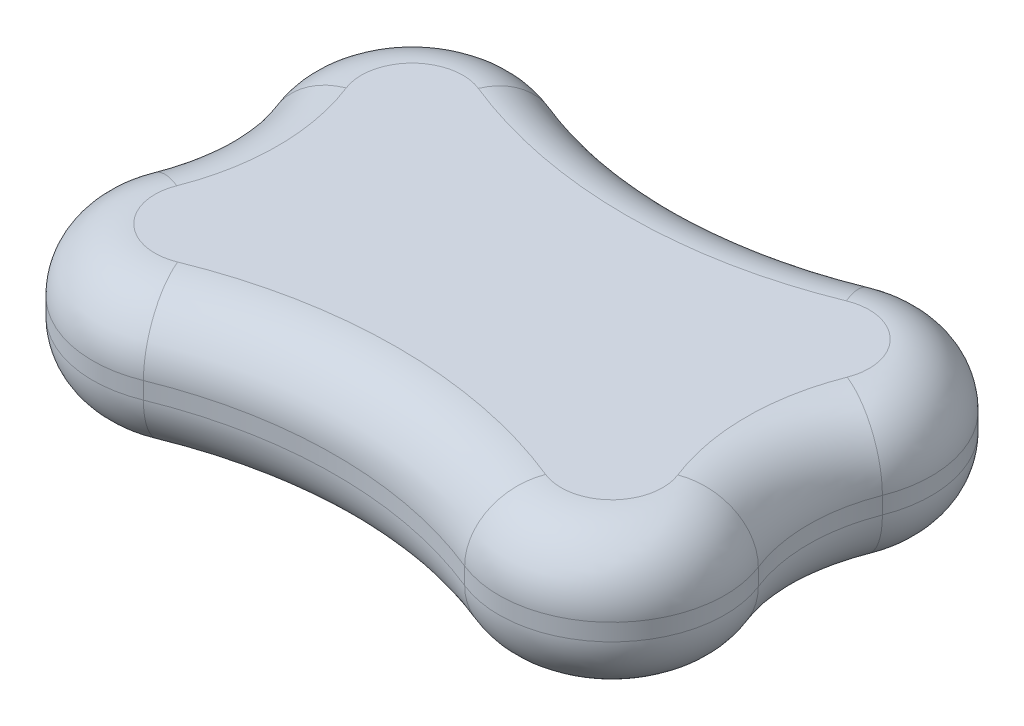
ISO-10303-21;
HEADER;
FILE_DESCRIPTION(('STEP AP214'),'2;1');
FILE_NAME('part.step','',(''),(''),'','','');
FILE_SCHEMA(('AUTOMOTIVE_DESIGN { 1 0 10303 214 1 1 1 1 }'));
ENDSEC;
DATA;
#1=APPLICATION_CONTEXT('core data for automotive mechanical design processes');
#2=APPLICATION_PROTOCOL_DEFINITION('international standard','automotive_design',2000,#1);
#3=PRODUCT_CONTEXT('',#1,'mechanical');
#4=PRODUCT('Part','Part','',(#3));
#5=PRODUCT_RELATED_PRODUCT_CATEGORY('part','',(#4));
#6=PRODUCT_DEFINITION_FORMATION('','',#4);
#7=PRODUCT_DEFINITION_CONTEXT('part definition',#1,'design');
#8=PRODUCT_DEFINITION('design','',#6,#7);
#9=PRODUCT_DEFINITION_SHAPE('','',#8);
#10=(LENGTH_UNIT() NAMED_UNIT(*) SI_UNIT(.MILLI.,.METRE.));
#11=(NAMED_UNIT(*) PLANE_ANGLE_UNIT() SI_UNIT($,.RADIAN.));
#12=(NAMED_UNIT(*) SI_UNIT($,.STERADIAN.) SOLID_ANGLE_UNIT());
#13=UNCERTAINTY_MEASURE_WITH_UNIT(LENGTH_MEASURE(1.E-05),#10,'distance_accuracy_value','');
#14=(GEOMETRIC_REPRESENTATION_CONTEXT(3) GLOBAL_UNCERTAINTY_ASSIGNED_CONTEXT((#13)) GLOBAL_UNIT_ASSIGNED_CONTEXT((#10,
#11,#12)) REPRESENTATION_CONTEXT('',''));
#15=CARTESIAN_POINT('',(0.,0.,0.));
#16=DIRECTION('',(0.,0.,1.));
#17=DIRECTION('',(1.,0.,0.));
#18=AXIS2_PLACEMENT_3D('',#15,#16,#17);
#19=CARTESIAN_POINT('',(71.8948860688024,50.,36.5376991282433));
#20=DIRECTION('',(0.,-1.,0.));
#21=DIRECTION('',(0.,0.,-1.));
#22=AXIS2_PLACEMENT_3D('',#19,#20,#21);
#23=CYLINDRICAL_SURFACE('',#22,40.);
#24=DIRECTION('',(0.,-1.,0.));
#25=VECTOR('',#24,1.);
#26=CARTESIAN_POINT('',(56.8482720264824,50.,73.5998011444736));
#27=LINE('',#26,#25);
#28=CARTESIAN_POINT('',(56.8482720264824,28.,73.5998011444736));
#29=VERTEX_POINT('',#28);
#30=CARTESIAN_POINT('',(56.8482720264824,22.,73.5998011444736));
#31=VERTEX_POINT('',#30);
#32=EDGE_CURVE('E183',#29,#31,#27,.T.);
#33=ORIENTED_EDGE('',*,*,#32,.T.);
#34=CARTESIAN_POINT('',(71.8948860688024,22.,36.5376991282433));
#35=DIRECTION('',(0.,1.,0.));
#36=DIRECTION('',(0.,0.,1.));
#37=AXIS2_PLACEMENT_3D('',#34,#35,#36);
#38=CIRCLE('',#37,40.);
#39=CARTESIAN_POINT('',(109.14404464425,22.,21.9603130312395));
#40=VERTEX_POINT('',#39);
#41=EDGE_CURVE('E230',#31,#40,#38,.T.);
#42=ORIENTED_EDGE('',*,*,#41,.T.);
#43=DIRECTION('',(0.,-1.,0.));
#44=VECTOR('',#43,1.);
#45=CARTESIAN_POINT('',(109.14404464425,50.,21.9603130312395));
#46=LINE('',#45,#44);
#47=CARTESIAN_POINT('',(109.14404464425,28.,21.9603130312395));
#48=VERTEX_POINT('',#47);
#49=EDGE_CURVE('E169',#48,#40,#46,.T.);
#50=ORIENTED_EDGE('',*,*,#49,.F.);
#51=CARTESIAN_POINT('',(71.8948860688024,28.,36.5376991282433));
#52=DIRECTION('',(0.,1.,0.));
#53=DIRECTION('',(0.,0.,1.));
#54=AXIS2_PLACEMENT_3D('',#51,#52,#53);
#55=CIRCLE('',#54,40.);
#56=EDGE_CURVE('E228',#48,#29,#55,.F.);
#57=ORIENTED_EDGE('',*,*,#56,.T.);
#58=EDGE_LOOP('',(#33,#42,#50,#57));
#59=FACE_BOUND('',#58,.T.);
#60=ADVANCED_FACE('F33',(#59),#23,.T.);
#61=CARTESIAN_POINT('',(165.2585755364,50.,0.));
#62=DIRECTION('',(0.,-1.,0.));
#63=DIRECTION('',(0.,0.,-1.));
#64=AXIS2_PLACEMENT_3D('',#61,#62,#63);
#65=CYLINDRICAL_SURFACE('',#64,60.2585755364002);
#66=ORIENTED_EDGE('',*,*,#49,.T.);
#67=CARTESIAN_POINT('',(165.2585755364,22.,0.));
#68=DIRECTION('',(0.,1.,0.));
#69=DIRECTION('',(0.,0.,1.));
#70=AXIS2_PLACEMENT_3D('',#67,#68,#69);
#71=CIRCLE('',#70,60.2585755364002);
#72=CARTESIAN_POINT('',(109.14404464425,22.,-21.9603130312394));
#73=VERTEX_POINT('',#72);
#74=EDGE_CURVE('E168',#40,#73,#71,.F.);
#75=ORIENTED_EDGE('',*,*,#74,.T.);
#76=DIRECTION('',(0.,-1.,0.));
#77=VECTOR('',#76,1.);
#78=CARTESIAN_POINT('',(109.14404464425,50.,-21.9603130312394));
#79=LINE('',#78,#77);
#80=CARTESIAN_POINT('',(109.14404464425,28.,-21.9603130312394));
#81=VERTEX_POINT('',#80);
#82=EDGE_CURVE('E150',#81,#73,#79,.T.);
#83=ORIENTED_EDGE('',*,*,#82,.F.);
#84=CARTESIAN_POINT('',(165.2585755364,28.,0.));
#85=DIRECTION('',(0.,1.,0.));
#86=DIRECTION('',(0.,0.,1.));
#87=AXIS2_PLACEMENT_3D('',#84,#85,#86);
#88=CIRCLE('',#87,60.2585755364002);
#89=EDGE_CURVE('E165',#81,#48,#88,.T.);
#90=ORIENTED_EDGE('',*,*,#89,.T.);
#91=EDGE_LOOP('',(#66,#75,#83,#90));
#92=FACE_BOUND('',#91,.T.);
#93=ADVANCED_FACE('F163',(#92),#65,.F.);
#94=CARTESIAN_POINT('',(71.8948860688024,50.,-36.5376991282433));
#95=DIRECTION('',(0.,-1.,0.));
#96=DIRECTION('',(0.,0.,-1.));
#97=AXIS2_PLACEMENT_3D('',#94,#95,#96);
#98=CYLINDRICAL_SURFACE('',#97,40.);
#99=ORIENTED_EDGE('',*,*,#82,.T.);
#100=CARTESIAN_POINT('',(71.8948860688024,22.,-36.5376991282433));
#101=DIRECTION('',(0.,1.,0.));
#102=DIRECTION('',(0.,0.,1.));
#103=AXIS2_PLACEMENT_3D('',#100,#101,#102);
#104=CIRCLE('',#103,40.);
#105=CARTESIAN_POINT('',(56.8482720264824,22.,-73.5998011444736));
#106=VERTEX_POINT('',#105);
#107=EDGE_CURVE('E157',#73,#106,#104,.T.);
#108=ORIENTED_EDGE('',*,*,#107,.T.);
#109=DIRECTION('',(0.,-1.,0.));
#110=VECTOR('',#109,1.);
#111=CARTESIAN_POINT('',(56.8482720264824,50.,-73.5998011444736));
#112=LINE('',#111,#110);
#113=CARTESIAN_POINT('',(56.8482720264824,28.,-73.5998011444736));
#114=VERTEX_POINT('',#113);
#115=EDGE_CURVE('E152',#114,#106,#112,.T.);
#116=ORIENTED_EDGE('',*,*,#115,.F.);
#117=CARTESIAN_POINT('',(71.8948860688024,28.,-36.5376991282433));
#118=DIRECTION('',(0.,1.,0.));
#119=DIRECTION('',(0.,0.,1.));
#120=AXIS2_PLACEMENT_3D('',#117,#118,#119);
#121=CIRCLE('',#120,40.);
#122=EDGE_CURVE('E147',#114,#81,#121,.F.);
#123=ORIENTED_EDGE('',*,*,#122,.T.);
#124=EDGE_LOOP('',(#99,#108,#116,#123));
#125=FACE_BOUND('',#124,.T.);
#126=ADVANCED_FACE('F149',(#125),#98,.T.);
#127=CARTESIAN_POINT('',(0.,50.,-213.625753253434));
#128=DIRECTION('',(0.,-1.,0.));
#129=DIRECTION('',(0.,0.,-1.));
#130=AXIS2_PLACEMENT_3D('',#127,#128,#129);
#131=CYLINDRICAL_SURFACE('',#130,151.125753253434);
#132=ORIENTED_EDGE('',*,*,#115,.T.);
#133=CARTESIAN_POINT('',(0.,22.,-213.625753253434));
#134=DIRECTION('',(0.,1.,0.));
#135=DIRECTION('',(0.,0.,1.));
#136=AXIS2_PLACEMENT_3D('',#133,#134,#135);
#137=CIRCLE('',#136,151.125753253434);
#138=CARTESIAN_POINT('',(-56.8482720264825,22.,-73.5998011444736));
#139=VERTEX_POINT('',#138);
#140=EDGE_CURVE('E209',#106,#139,#137,.F.);
#141=ORIENTED_EDGE('',*,*,#140,.T.);
#142=DIRECTION('',(0.,-1.,0.));
#143=VECTOR('',#142,1.);
#144=CARTESIAN_POINT('',(-56.8482720264825,50.,-73.5998011444736));
#145=LINE('',#144,#143);
#146=CARTESIAN_POINT('',(-56.8482720264825,28.,-73.5998011444736));
#147=VERTEX_POINT('',#146);
#148=EDGE_CURVE('E291',#147,#139,#145,.T.);
#149=ORIENTED_EDGE('',*,*,#148,.F.);
#150=CARTESIAN_POINT('',(0.,28.,-213.625753253434));
#151=DIRECTION('',(0.,1.,0.));
#152=DIRECTION('',(0.,0.,1.));
#153=AXIS2_PLACEMENT_3D('',#150,#151,#152);
#154=CIRCLE('',#153,151.125753253434);
#155=EDGE_CURVE('E207',#147,#114,#154,.T.);
#156=ORIENTED_EDGE('',*,*,#155,.T.);
#157=EDGE_LOOP('',(#132,#141,#149,#156));
#158=FACE_BOUND('',#157,.T.);
#159=ADVANCED_FACE('F288',(#158),#131,.F.);
#160=CARTESIAN_POINT('',(-71.8948860688024,50.,-36.5376991282433));
#161=DIRECTION('',(0.,-1.,0.));
#162=DIRECTION('',(0.,0.,-1.));
#163=AXIS2_PLACEMENT_3D('',#160,#161,#162);
#164=CYLINDRICAL_SURFACE('',#163,40.);
#165=ORIENTED_EDGE('',*,*,#148,.T.);
#166=CARTESIAN_POINT('',(-71.8948860688024,22.,-36.5376991282433));
#167=DIRECTION('',(0.,1.,0.));
#168=DIRECTION('',(0.,0.,1.));
#169=AXIS2_PLACEMENT_3D('',#166,#167,#168);
#170=CIRCLE('',#169,40.);
#171=CARTESIAN_POINT('',(-109.14404464425,22.,-21.9603130312394));
#172=VERTEX_POINT('',#171);
#173=EDGE_CURVE('E213',#139,#172,#170,.T.);
#174=ORIENTED_EDGE('',*,*,#173,.T.);
#175=DIRECTION('',(0.,-1.,0.));
#176=VECTOR('',#175,1.);
#177=CARTESIAN_POINT('',(-109.14404464425,50.,-21.9603130312394));
#178=LINE('',#177,#176);
#179=CARTESIAN_POINT('',(-109.14404464425,28.,-21.9603130312394));
#180=VERTEX_POINT('',#179);
#181=EDGE_CURVE('E294',#180,#172,#178,.T.);
#182=ORIENTED_EDGE('',*,*,#181,.F.);
#183=CARTESIAN_POINT('',(-71.8948860688024,28.,-36.5376991282433));
#184=DIRECTION('',(0.,1.,0.));
#185=DIRECTION('',(0.,0.,1.));
#186=AXIS2_PLACEMENT_3D('',#183,#184,#185);
#187=CIRCLE('',#186,40.);
#188=EDGE_CURVE('E211',#180,#147,#187,.F.);
#189=ORIENTED_EDGE('',*,*,#188,.T.);
#190=EDGE_LOOP('',(#165,#174,#182,#189));
#191=FACE_BOUND('',#190,.T.);
#192=ADVANCED_FACE('F325',(#191),#164,.T.);
#193=CARTESIAN_POINT('',(-165.2585755364,50.,0.));
#194=DIRECTION('',(0.,-1.,0.));
#195=DIRECTION('',(0.,0.,-1.));
#196=AXIS2_PLACEMENT_3D('',#193,#194,#195);
#197=CYLINDRICAL_SURFACE('',#196,60.2585755364002);
#198=ORIENTED_EDGE('',*,*,#181,.T.);
#199=CARTESIAN_POINT('',(-165.2585755364,22.,0.));
#200=DIRECTION('',(0.,1.,0.));
#201=DIRECTION('',(0.,0.,1.));
#202=AXIS2_PLACEMENT_3D('',#199,#200,#201);
#203=CIRCLE('',#202,60.2585755364002);
#204=CARTESIAN_POINT('',(-109.14404464425,22.,21.9603130312394));
#205=VERTEX_POINT('',#204);
#206=EDGE_CURVE('E217',#172,#205,#203,.F.);
#207=ORIENTED_EDGE('',*,*,#206,.T.);
#208=DIRECTION('',(0.,-1.,0.));
#209=VECTOR('',#208,1.);
#210=CARTESIAN_POINT('',(-109.14404464425,50.,21.9603130312394));
#211=LINE('',#210,#209);
#212=CARTESIAN_POINT('',(-109.14404464425,28.,21.9603130312394));
#213=VERTEX_POINT('',#212);
#214=EDGE_CURVE('E298',#213,#205,#211,.T.);
#215=ORIENTED_EDGE('',*,*,#214,.F.);
#216=CARTESIAN_POINT('',(-165.2585755364,28.,0.));
#217=DIRECTION('',(0.,1.,0.));
#218=DIRECTION('',(0.,0.,1.));
#219=AXIS2_PLACEMENT_3D('',#216,#217,#218);
#220=CIRCLE('',#219,60.2585755364002);
#221=EDGE_CURVE('E215',#213,#180,#220,.T.);
#222=ORIENTED_EDGE('',*,*,#221,.T.);
#223=EDGE_LOOP('',(#198,#207,#215,#222));
#224=FACE_BOUND('',#223,.T.);
#225=ADVANCED_FACE('F328',(#224),#197,.F.);
#226=CARTESIAN_POINT('',(-71.8948860688024,50.,36.5376991282433));
#227=DIRECTION('',(0.,-1.,0.));
#228=DIRECTION('',(0.,0.,-1.));
#229=AXIS2_PLACEMENT_3D('',#226,#227,#228);
#230=CYLINDRICAL_SURFACE('',#229,40.);
#231=ORIENTED_EDGE('',*,*,#214,.T.);
#232=CARTESIAN_POINT('',(-71.8948860688024,22.,36.5376991282433));
#233=DIRECTION('',(0.,1.,0.));
#234=DIRECTION('',(0.,0.,1.));
#235=AXIS2_PLACEMENT_3D('',#232,#233,#234);
#236=CIRCLE('',#235,40.);
#237=CARTESIAN_POINT('',(-56.8482720264825,22.,73.5998011444736));
#238=VERTEX_POINT('',#237);
#239=EDGE_CURVE('E222',#205,#238,#236,.T.);
#240=ORIENTED_EDGE('',*,*,#239,.T.);
#241=DIRECTION('',(0.,-1.,0.));
#242=VECTOR('',#241,1.);
#243=CARTESIAN_POINT('',(-56.8482720264825,50.,73.5998011444736));
#244=LINE('',#243,#242);
#245=CARTESIAN_POINT('',(-56.8482720264825,28.,73.5998011444736));
#246=VERTEX_POINT('',#245);
#247=EDGE_CURVE('E265',#246,#238,#244,.T.);
#248=ORIENTED_EDGE('',*,*,#247,.F.);
#249=CARTESIAN_POINT('',(-71.8948860688024,28.,36.5376991282433));
#250=DIRECTION('',(0.,1.,0.));
#251=DIRECTION('',(0.,0.,1.));
#252=AXIS2_PLACEMENT_3D('',#249,#250,#251);
#253=CIRCLE('',#252,40.);
#254=EDGE_CURVE('E219',#246,#213,#253,.F.);
#255=ORIENTED_EDGE('',*,*,#254,.T.);
#256=EDGE_LOOP('',(#231,#240,#248,#255));
#257=FACE_BOUND('',#256,.T.);
#258=ADVANCED_FACE('F345',(#257),#230,.T.);
#259=CARTESIAN_POINT('',(0.,50.,213.625753253434));
#260=DIRECTION('',(0.,-1.,0.));
#261=DIRECTION('',(0.,0.,-1.));
#262=AXIS2_PLACEMENT_3D('',#259,#260,#261);
#263=CYLINDRICAL_SURFACE('',#262,151.125753253434);
#264=ORIENTED_EDGE('',*,*,#247,.T.);
#265=CARTESIAN_POINT('',(0.,22.,213.625753253434));
#266=DIRECTION('',(0.,1.,0.));
#267=DIRECTION('',(0.,0.,1.));
#268=AXIS2_PLACEMENT_3D('',#265,#266,#267);
#269=CIRCLE('',#268,151.125753253434);
#270=EDGE_CURVE('E226',#238,#31,#269,.F.);
#271=ORIENTED_EDGE('',*,*,#270,.T.);
#272=ORIENTED_EDGE('',*,*,#32,.F.);
#273=CARTESIAN_POINT('',(0.,28.,213.625753253434));
#274=DIRECTION('',(0.,1.,0.));
#275=DIRECTION('',(0.,0.,1.));
#276=AXIS2_PLACEMENT_3D('',#273,#274,#275);
#277=CIRCLE('',#276,151.125753253434);
#278=EDGE_CURVE('E224',#29,#246,#277,.T.);
#279=ORIENTED_EDGE('',*,*,#278,.T.);
#280=EDGE_LOOP('',(#264,#271,#272,#279));
#281=FACE_BOUND('',#280,.T.);
#282=ADVANCED_FACE('F348',(#281),#263,.F.);
#283=CARTESIAN_POINT('',(-35.9474430344012,50.,125.081726190839));
#284=DIRECTION('',(0.,1.,0.));
#285=DIRECTION('',(0.,0.,1.));
#286=AXIS2_PLACEMENT_3D('',#283,#284,#285);
#287=PLANE('',#286);
#288=CARTESIAN_POINT('',(-165.2585755364,50.,0.));
#289=DIRECTION('',(0.,1.,0.));
#290=DIRECTION('',(0.,0.,1.));
#291=AXIS2_PLACEMENT_3D('',#288,#289,#290);
#292=CIRCLE('',#291,82.2585755364002);
#293=CARTESIAN_POINT('',(-88.6570074277541,50.,-29.9778753845916));
#294=VERTEX_POINT('',#293);
#295=CARTESIAN_POINT('',(-88.657007427754,50.,29.9778753845916));
#296=VERTEX_POINT('',#295);
#297=EDGE_CURVE('E42',#294,#296,#292,.F.);
#298=ORIENTED_EDGE('',*,*,#297,.T.);
#299=CARTESIAN_POINT('',(-71.8948860688024,50.,36.5376991282433));
#300=DIRECTION('',(0.,1.,0.));
#301=DIRECTION('',(0.,0.,1.));
#302=AXIS2_PLACEMENT_3D('',#299,#300,#301);
#303=CIRCLE('',#302,18.);
#304=CARTESIAN_POINT('',(-65.1239097497584,50.,53.2156450355469));
#305=VERTEX_POINT('',#304);
#306=EDGE_CURVE('E11',#296,#305,#303,.T.);
#307=ORIENTED_EDGE('',*,*,#306,.T.);
#308=CARTESIAN_POINT('',(0.,50.,213.625753253434));
#309=DIRECTION('',(0.,1.,0.));
#310=DIRECTION('',(0.,0.,1.));
#311=AXIS2_PLACEMENT_3D('',#308,#309,#310);
#312=CIRCLE('',#311,173.125753253434);
#313=CARTESIAN_POINT('',(65.1239097497584,50.,53.215645035547));
#314=VERTEX_POINT('',#313);
#315=EDGE_CURVE('E232',#305,#314,#312,.F.);
#316=ORIENTED_EDGE('',*,*,#315,.T.);
#317=CARTESIAN_POINT('',(71.8948860688024,50.,36.5376991282433));
#318=DIRECTION('',(0.,1.,0.));
#319=DIRECTION('',(0.,0.,1.));
#320=AXIS2_PLACEMENT_3D('',#317,#318,#319);
#321=CIRCLE('',#320,18.);
#322=CARTESIAN_POINT('',(88.6570074277541,50.,29.9778753845916));
#323=VERTEX_POINT('',#322);
#324=EDGE_CURVE('E234',#314,#323,#321,.T.);
#325=ORIENTED_EDGE('',*,*,#324,.T.);
#326=CARTESIAN_POINT('',(165.2585755364,50.,0.));
#327=DIRECTION('',(0.,1.,0.));
#328=DIRECTION('',(0.,0.,1.));
#329=AXIS2_PLACEMENT_3D('',#326,#327,#328);
#330=CIRCLE('',#329,82.2585755364002);
#331=CARTESIAN_POINT('',(88.657007427754,50.,-29.9778753845916));
#332=VERTEX_POINT('',#331);
#333=EDGE_CURVE('E236',#323,#332,#330,.F.);
#334=ORIENTED_EDGE('',*,*,#333,.T.);
#335=CARTESIAN_POINT('',(71.8948860688024,50.,-36.5376991282433));
#336=DIRECTION('',(0.,1.,0.));
#337=DIRECTION('',(0.,0.,1.));
#338=AXIS2_PLACEMENT_3D('',#335,#336,#337);
#339=CIRCLE('',#338,18.);
#340=CARTESIAN_POINT('',(65.1239097497584,50.,-53.2156450355469));
#341=VERTEX_POINT('',#340);
#342=EDGE_CURVE('E174',#332,#341,#339,.T.);
#343=ORIENTED_EDGE('',*,*,#342,.T.);
#344=CARTESIAN_POINT('',(0.,50.,-213.625753253434));
#345=DIRECTION('',(0.,1.,0.));
#346=DIRECTION('',(0.,0.,1.));
#347=AXIS2_PLACEMENT_3D('',#344,#345,#346);
#348=CIRCLE('',#347,173.125753253434);
#349=CARTESIAN_POINT('',(-65.1239097497584,50.,-53.215645035547));
#350=VERTEX_POINT('',#349);
#351=EDGE_CURVE('E239',#341,#350,#348,.F.);
#352=ORIENTED_EDGE('',*,*,#351,.T.);
#353=CARTESIAN_POINT('',(-71.8948860688024,50.,-36.5376991282433));
#354=DIRECTION('',(0.,1.,0.));
#355=DIRECTION('',(0.,0.,1.));
#356=AXIS2_PLACEMENT_3D('',#353,#354,#355);
#357=CIRCLE('',#356,18.);
#358=EDGE_CURVE('E53',#350,#294,#357,.T.);
#359=ORIENTED_EDGE('',*,*,#358,.T.);
#360=EDGE_LOOP('',(#298,#307,#316,#325,#334,#343,#352,#359));
#361=FACE_BOUND('',#360,.T.);
#362=ADVANCED_FACE('F503',(#361),#287,.T.);
#363=CARTESIAN_POINT('',(-35.9474430344012,0.,125.081726190839));
#364=DIRECTION('',(0.,1.,0.));
#365=DIRECTION('',(0.,0.,1.));
#366=AXIS2_PLACEMENT_3D('',#363,#364,#365);
#367=PLANE('',#366);
#368=CARTESIAN_POINT('',(71.8948860688024,0.,-36.5376991282433));
#369=DIRECTION('',(0.,1.,0.));
#370=DIRECTION('',(0.,0.,1.));
#371=AXIS2_PLACEMENT_3D('',#368,#369,#370);
#372=CIRCLE('',#371,18.);
#373=CARTESIAN_POINT('',(65.1239097497584,0.,-53.215645035547));
#374=VERTEX_POINT('',#373);
#375=CARTESIAN_POINT('',(88.657007427754,0.,-29.9778753845915));
#376=VERTEX_POINT('',#375);
#377=EDGE_CURVE('E202',#374,#376,#372,.F.);
#378=ORIENTED_EDGE('',*,*,#377,.T.);
#379=CARTESIAN_POINT('',(165.2585755364,0.,0.));
#380=DIRECTION('',(0.,1.,0.));
#381=DIRECTION('',(0.,0.,1.));
#382=AXIS2_PLACEMENT_3D('',#379,#380,#381);
#383=CIRCLE('',#382,82.2585755364002);
#384=CARTESIAN_POINT('',(88.6570074277541,0.,29.9778753845916));
#385=VERTEX_POINT('',#384);
#386=EDGE_CURVE('E158',#376,#385,#383,.T.);
#387=ORIENTED_EDGE('',*,*,#386,.T.);
#388=CARTESIAN_POINT('',(71.8948860688024,0.,36.5376991282433));
#389=DIRECTION('',(0.,1.,0.));
#390=DIRECTION('',(0.,0.,1.));
#391=AXIS2_PLACEMENT_3D('',#388,#389,#390);
#392=CIRCLE('',#391,18.);
#393=CARTESIAN_POINT('',(65.1239097497584,0.,53.2156450355469));
#394=VERTEX_POINT('',#393);
#395=EDGE_CURVE('E185',#385,#394,#392,.F.);
#396=ORIENTED_EDGE('',*,*,#395,.T.);
#397=CARTESIAN_POINT('',(0.,0.,213.625753253434));
#398=DIRECTION('',(0.,1.,0.));
#399=DIRECTION('',(0.,0.,1.));
#400=AXIS2_PLACEMENT_3D('',#397,#398,#399);
#401=CIRCLE('',#400,173.125753253434);
#402=CARTESIAN_POINT('',(-65.1239097497584,0.,53.2156450355469));
#403=VERTEX_POINT('',#402);
#404=EDGE_CURVE('E192',#394,#403,#401,.T.);
#405=ORIENTED_EDGE('',*,*,#404,.T.);
#406=CARTESIAN_POINT('',(-71.8948860688024,0.,36.5376991282433));
#407=DIRECTION('',(0.,1.,0.));
#408=DIRECTION('',(0.,0.,1.));
#409=AXIS2_PLACEMENT_3D('',#406,#407,#408);
#410=CIRCLE('',#409,18.);
#411=CARTESIAN_POINT('',(-88.6570074277541,0.,29.9778753845915));
#412=VERTEX_POINT('',#411);
#413=EDGE_CURVE('E194',#403,#412,#410,.F.);
#414=ORIENTED_EDGE('',*,*,#413,.T.);
#415=CARTESIAN_POINT('',(-165.2585755364,0.,0.));
#416=DIRECTION('',(0.,1.,0.));
#417=DIRECTION('',(0.,0.,1.));
#418=AXIS2_PLACEMENT_3D('',#415,#416,#417);
#419=CIRCLE('',#418,82.2585755364002);
#420=CARTESIAN_POINT('',(-88.657007427754,0.,-29.9778753845916));
#421=VERTEX_POINT('',#420);
#422=EDGE_CURVE('E196',#412,#421,#419,.T.);
#423=ORIENTED_EDGE('',*,*,#422,.T.);
#424=CARTESIAN_POINT('',(-71.8948860688024,0.,-36.5376991282433));
#425=DIRECTION('',(0.,1.,0.));
#426=DIRECTION('',(0.,0.,1.));
#427=AXIS2_PLACEMENT_3D('',#424,#425,#426);
#428=CIRCLE('',#427,18.);
#429=CARTESIAN_POINT('',(-65.1239097497585,0.,-53.215645035547));
#430=VERTEX_POINT('',#429);
#431=EDGE_CURVE('E198',#421,#430,#428,.F.);
#432=ORIENTED_EDGE('',*,*,#431,.T.);
#433=CARTESIAN_POINT('',(0.,0.,-213.625753253434));
#434=DIRECTION('',(0.,1.,0.));
#435=DIRECTION('',(0.,0.,1.));
#436=AXIS2_PLACEMENT_3D('',#433,#434,#435);
#437=CIRCLE('',#436,173.125753253434);
#438=EDGE_CURVE('E200',#430,#374,#437,.T.);
#439=ORIENTED_EDGE('',*,*,#438,.T.);
#440=EDGE_LOOP('',(#378,#387,#396,#405,#414,#423,#432,#439));
#441=FACE_BOUND('',#440,.T.);
#442=ADVANCED_FACE('F398',(#441),#367,.F.);
#443=CARTESIAN_POINT('',(-165.2585755364,22.,0.));
#444=DIRECTION('',(0.,1.,0.));
#445=DIRECTION('',(0.,0.,1.));
#446=AXIS2_PLACEMENT_3D('',#443,#444,#445);
#447=TOROIDAL_SURFACE('',#446,82.2585755364002,22.);
#448=CARTESIAN_POINT('',(-88.657007427754,22.,-29.9778753845916));
#449=DIRECTION('',(-0.364434652425097,0.,-0.931228964386202));
#450=DIRECTION('',(-0.931228964386202,0.,0.364434652425097));
#451=AXIS2_PLACEMENT_3D('',#448,#449,#450);
#452=CIRCLE('',#451,22.);
#453=EDGE_CURVE('E259',#421,#172,#452,.T.);
#454=ORIENTED_EDGE('',*,*,#453,.F.);
#455=ORIENTED_EDGE('',*,*,#422,.F.);
#456=CARTESIAN_POINT('',(-88.657007427754,22.,29.9778753845916));
#457=DIRECTION('',(-0.364434652425097,0.,0.931228964386202));
#458=DIRECTION('',(0.931228964386202,0.,0.364434652425097));
#459=AXIS2_PLACEMENT_3D('',#456,#457,#458);
#460=CIRCLE('',#459,22.);
#461=EDGE_CURVE('E262',#205,#412,#460,.T.);
#462=ORIENTED_EDGE('',*,*,#461,.F.);
#463=ORIENTED_EDGE('',*,*,#206,.F.);
#464=EDGE_LOOP('',(#454,#455,#462,#463));
#465=FACE_BOUND('',#464,.T.);
#466=ADVANCED_FACE('F334',(#465),#447,.T.);
#467=CARTESIAN_POINT('',(-71.8948860688024,22.,36.5376991282433));
#468=DIRECTION('',(0.,1.,0.));
#469=DIRECTION('',(0.,0.,1.));
#470=AXIS2_PLACEMENT_3D('',#467,#468,#469);
#471=DEGENERATE_TOROIDAL_SURFACE('',#470,18.,22.,.T.);
#472=ORIENTED_EDGE('',*,*,#461,.T.);
#473=ORIENTED_EDGE('',*,*,#413,.F.);
#474=CARTESIAN_POINT('',(-65.1239097497584,22.,53.215645035547));
#475=DIRECTION('',(0.926552550405757,0.,-0.376165351057997));
#476=DIRECTION('',(-0.376165351057997,0.,-0.926552550405758));
#477=AXIS2_PLACEMENT_3D('',#474,#475,#476);
#478=CIRCLE('',#477,22.);
#479=EDGE_CURVE('E256',#238,#403,#478,.T.);
#480=ORIENTED_EDGE('',*,*,#479,.F.);
#481=ORIENTED_EDGE('',*,*,#239,.F.);
#482=EDGE_LOOP('',(#472,#473,#480,#481));
#483=FACE_BOUND('',#482,.T.);
#484=ADVANCED_FACE('F340',(#483),#471,.T.);
#485=CARTESIAN_POINT('',(-71.8948860688024,22.,-36.5376991282433));
#486=DIRECTION('',(0.,1.,0.));
#487=DIRECTION('',(0.,0.,1.));
#488=AXIS2_PLACEMENT_3D('',#485,#486,#487);
#489=DEGENERATE_TOROIDAL_SURFACE('',#488,18.,22.,.T.);
#490=ORIENTED_EDGE('',*,*,#453,.T.);
#491=ORIENTED_EDGE('',*,*,#173,.F.);
#492=CARTESIAN_POINT('',(-65.1239097497585,22.,-53.215645035547));
#493=DIRECTION('',(0.926552550405757,0.,0.376165351057999));
#494=DIRECTION('',(0.376165351057999,0.,-0.926552550405757));
#495=AXIS2_PLACEMENT_3D('',#492,#493,#494);
#496=CIRCLE('',#495,22.);
#497=EDGE_CURVE('E253',#430,#139,#496,.T.);
#498=ORIENTED_EDGE('',*,*,#497,.F.);
#499=ORIENTED_EDGE('',*,*,#431,.F.);
#500=EDGE_LOOP('',(#490,#491,#498,#499));
#501=FACE_BOUND('',#500,.T.);
#502=ADVANCED_FACE('F322',(#501),#489,.T.);
#503=CARTESIAN_POINT('',(0.,22.,213.625753253434));
#504=DIRECTION('',(0.,1.,0.));
#505=DIRECTION('',(0.,0.,1.));
#506=AXIS2_PLACEMENT_3D('',#503,#504,#505);
#507=TOROIDAL_SURFACE('',#506,173.125753253434,22.);
#508=ORIENTED_EDGE('',*,*,#479,.T.);
#509=ORIENTED_EDGE('',*,*,#404,.F.);
#510=CARTESIAN_POINT('',(65.1239097497584,22.,53.2156450355469));
#511=DIRECTION('',(0.926552550405757,0.,0.376165351057999));
#512=DIRECTION('',(0.376165351057999,0.,-0.926552550405757));
#513=AXIS2_PLACEMENT_3D('',#510,#511,#512);
#514=CIRCLE('',#513,22.);
#515=EDGE_CURVE('E250',#31,#394,#514,.T.);
#516=ORIENTED_EDGE('',*,*,#515,.F.);
#517=ORIENTED_EDGE('',*,*,#270,.F.);
#518=EDGE_LOOP('',(#508,#509,#516,#517));
#519=FACE_BOUND('',#518,.T.);
#520=ADVANCED_FACE('F388',(#519),#507,.T.);
#521=CARTESIAN_POINT('',(0.,22.,-213.625753253434));
#522=DIRECTION('',(0.,1.,0.));
#523=DIRECTION('',(0.,0.,1.));
#524=AXIS2_PLACEMENT_3D('',#521,#522,#523);
#525=TOROIDAL_SURFACE('',#524,173.125753253434,22.);
#526=ORIENTED_EDGE('',*,*,#497,.T.);
#527=ORIENTED_EDGE('',*,*,#140,.F.);
#528=CARTESIAN_POINT('',(65.1239097497584,22.,-53.215645035547));
#529=DIRECTION('',(0.926552550405757,0.,-0.376165351057999));
#530=DIRECTION('',(-0.376165351057999,0.,-0.926552550405757));
#531=AXIS2_PLACEMENT_3D('',#528,#529,#530);
#532=CIRCLE('',#531,22.);
#533=EDGE_CURVE('E247',#374,#106,#532,.T.);
#534=ORIENTED_EDGE('',*,*,#533,.F.);
#535=ORIENTED_EDGE('',*,*,#438,.F.);
#536=EDGE_LOOP('',(#526,#527,#534,#535));
#537=FACE_BOUND('',#536,.T.);
#538=ADVANCED_FACE('F318',(#537),#525,.T.);
#539=CARTESIAN_POINT('',(71.8948860688024,22.,36.5376991282433));
#540=DIRECTION('',(0.,1.,0.));
#541=DIRECTION('',(0.,0.,1.));
#542=AXIS2_PLACEMENT_3D('',#539,#540,#541);
#543=DEGENERATE_TOROIDAL_SURFACE('',#542,18.,22.,.T.);
#544=ORIENTED_EDGE('',*,*,#515,.T.);
#545=ORIENTED_EDGE('',*,*,#395,.F.);
#546=CARTESIAN_POINT('',(88.6570074277541,22.,29.9778753845916));
#547=DIRECTION('',(-0.364434652425096,0.,-0.931228964386203));
#548=DIRECTION('',(-0.931228964386203,0.,0.364434652425096));
#549=AXIS2_PLACEMENT_3D('',#546,#547,#548);
#550=CIRCLE('',#549,22.);
#551=EDGE_CURVE('E245',#40,#385,#550,.T.);
#552=ORIENTED_EDGE('',*,*,#551,.F.);
#553=ORIENTED_EDGE('',*,*,#41,.F.);
#554=EDGE_LOOP('',(#544,#545,#552,#553));
#555=FACE_BOUND('',#554,.T.);
#556=ADVANCED_FACE('F306',(#555),#543,.T.);
#557=CARTESIAN_POINT('',(71.8948860688024,22.,-36.5376991282433));
#558=DIRECTION('',(0.,1.,0.));
#559=DIRECTION('',(0.,0.,1.));
#560=AXIS2_PLACEMENT_3D('',#557,#558,#559);
#561=DEGENERATE_TOROIDAL_SURFACE('',#560,18.,22.,.T.);
#562=ORIENTED_EDGE('',*,*,#533,.T.);
#563=ORIENTED_EDGE('',*,*,#107,.F.);
#564=CARTESIAN_POINT('',(88.657007427754,22.,-29.9778753845915));
#565=DIRECTION('',(-0.364434652425097,0.,0.931228964386203));
#566=DIRECTION('',(0.931228964386203,0.,0.364434652425097));
#567=AXIS2_PLACEMENT_3D('',#564,#565,#566);
#568=CIRCLE('',#567,22.);
#569=EDGE_CURVE('E243',#376,#73,#568,.T.);
#570=ORIENTED_EDGE('',*,*,#569,.F.);
#571=ORIENTED_EDGE('',*,*,#377,.F.);
#572=EDGE_LOOP('',(#562,#563,#570,#571));
#573=FACE_BOUND('',#572,.T.);
#574=ADVANCED_FACE('F314',(#573),#561,.T.);
#575=CARTESIAN_POINT('',(165.2585755364,22.,0.));
#576=DIRECTION('',(0.,1.,0.));
#577=DIRECTION('',(0.,0.,1.));
#578=AXIS2_PLACEMENT_3D('',#575,#576,#577);
#579=TOROIDAL_SURFACE('',#578,82.2585755364002,22.);
#580=ORIENTED_EDGE('',*,*,#551,.T.);
#581=ORIENTED_EDGE('',*,*,#386,.F.);
#582=ORIENTED_EDGE('',*,*,#569,.T.);
#583=ORIENTED_EDGE('',*,*,#74,.F.);
#584=EDGE_LOOP('',(#580,#581,#582,#583));
#585=FACE_BOUND('',#584,.T.);
#586=ADVANCED_FACE('F309',(#585),#579,.T.);
#587=CARTESIAN_POINT('',(71.8948860688024,28.,-36.5376991282433));
#588=DIRECTION('',(0.,1.,0.));
#589=DIRECTION('',(0.,0.,1.));
#590=AXIS2_PLACEMENT_3D('',#587,#588,#589);
#591=DEGENERATE_TOROIDAL_SURFACE('',#590,18.,22.,.T.);
#592=CARTESIAN_POINT('',(88.6570074277541,28.,-29.9778753845916));
#593=DIRECTION('',(-0.364434652425097,0.,0.931228964386202));
#594=DIRECTION('',(0.931228964386202,0.,0.364434652425097));
#595=AXIS2_PLACEMENT_3D('',#592,#593,#594);
#596=CIRCLE('',#595,22.);
#597=EDGE_CURVE('E173',#81,#332,#596,.T.);
#598=ORIENTED_EDGE('',*,*,#597,.F.);
#599=ORIENTED_EDGE('',*,*,#122,.F.);
#600=CARTESIAN_POINT('',(65.1239097497584,28.,-53.2156450355469));
#601=DIRECTION('',(-0.926552550405757,0.,0.376165351057999));
#602=DIRECTION('',(0.376165351057999,0.,0.926552550405757));
#603=AXIS2_PLACEMENT_3D('',#600,#601,#602);
#604=CIRCLE('',#603,22.);
#605=EDGE_CURVE('E37',#341,#114,#604,.T.);
#606=ORIENTED_EDGE('',*,*,#605,.F.);
#607=ORIENTED_EDGE('',*,*,#342,.F.);
#608=EDGE_LOOP('',(#598,#599,#606,#607));
#609=FACE_BOUND('',#608,.T.);
#610=ADVANCED_FACE('F35',(#609),#591,.T.);
#611=CARTESIAN_POINT('',(0.,28.,-213.625753253434));
#612=DIRECTION('',(0.,1.,0.));
#613=DIRECTION('',(0.,0.,1.));
#614=AXIS2_PLACEMENT_3D('',#611,#612,#613);
#615=TOROIDAL_SURFACE('',#614,173.125753253434,22.);
#616=ORIENTED_EDGE('',*,*,#605,.T.);
#617=ORIENTED_EDGE('',*,*,#155,.F.);
#618=CARTESIAN_POINT('',(-65.1239097497584,28.,-53.215645035547));
#619=DIRECTION('',(-0.926552550405757,0.,-0.376165351057998));
#620=DIRECTION('',(-0.376165351057998,0.,0.926552550405757));
#621=AXIS2_PLACEMENT_3D('',#618,#619,#620);
#622=CIRCLE('',#621,22.);
#623=EDGE_CURVE('E177',#350,#147,#622,.T.);
#624=ORIENTED_EDGE('',*,*,#623,.F.);
#625=ORIENTED_EDGE('',*,*,#351,.F.);
#626=EDGE_LOOP('',(#616,#617,#624,#625));
#627=FACE_BOUND('',#626,.T.);
#628=ADVANCED_FACE('F285',(#627),#615,.T.);
#629=CARTESIAN_POINT('',(165.2585755364,28.,0.));
#630=DIRECTION('',(0.,1.,0.));
#631=DIRECTION('',(0.,0.,1.));
#632=AXIS2_PLACEMENT_3D('',#629,#630,#631);
#633=TOROIDAL_SURFACE('',#632,82.2585755364002,22.);
#634=ORIENTED_EDGE('',*,*,#597,.T.);
#635=ORIENTED_EDGE('',*,*,#333,.F.);
#636=CARTESIAN_POINT('',(88.6570074277541,28.,29.9778753845916));
#637=DIRECTION('',(0.364434652425097,0.,0.931228964386202));
#638=DIRECTION('',(0.931228964386202,0.,-0.364434652425097));
#639=AXIS2_PLACEMENT_3D('',#636,#637,#638);
#640=CIRCLE('',#639,22.);
#641=EDGE_CURVE('E181',#48,#323,#640,.T.);
#642=ORIENTED_EDGE('',*,*,#641,.F.);
#643=ORIENTED_EDGE('',*,*,#89,.F.);
#644=EDGE_LOOP('',(#634,#635,#642,#643));
#645=FACE_BOUND('',#644,.T.);
#646=ADVANCED_FACE('F179',(#645),#633,.T.);
#647=CARTESIAN_POINT('',(-71.8948860688024,28.,-36.5376991282433));
#648=DIRECTION('',(0.,1.,0.));
#649=DIRECTION('',(0.,0.,1.));
#650=AXIS2_PLACEMENT_3D('',#647,#648,#649);
#651=DEGENERATE_TOROIDAL_SURFACE('',#650,18.,22.,.T.);
#652=ORIENTED_EDGE('',*,*,#623,.T.);
#653=ORIENTED_EDGE('',*,*,#188,.F.);
#654=CARTESIAN_POINT('',(-88.6570074277541,28.,-29.9778753845916));
#655=DIRECTION('',(0.364434652425097,0.,0.931228964386202));
#656=DIRECTION('',(0.931228964386202,0.,-0.364434652425097));
#657=AXIS2_PLACEMENT_3D('',#654,#655,#656);
#658=CIRCLE('',#657,22.);
#659=EDGE_CURVE('E273',#294,#180,#658,.T.);
#660=ORIENTED_EDGE('',*,*,#659,.F.);
#661=ORIENTED_EDGE('',*,*,#358,.F.);
#662=EDGE_LOOP('',(#652,#653,#660,#661));
#663=FACE_BOUND('',#662,.T.);
#664=ADVANCED_FACE('F281',(#663),#651,.T.);
#665=CARTESIAN_POINT('',(71.8948860688024,28.,36.5376991282433));
#666=DIRECTION('',(0.,1.,0.));
#667=DIRECTION('',(0.,0.,1.));
#668=AXIS2_PLACEMENT_3D('',#665,#666,#667);
#669=DEGENERATE_TOROIDAL_SURFACE('',#668,18.,22.,.T.);
#670=ORIENTED_EDGE('',*,*,#641,.T.);
#671=ORIENTED_EDGE('',*,*,#324,.F.);
#672=CARTESIAN_POINT('',(65.1239097497584,28.,53.2156450355469));
#673=DIRECTION('',(-0.926552550405757,0.,-0.376165351057999));
#674=DIRECTION('',(-0.376165351057999,0.,0.926552550405757));
#675=AXIS2_PLACEMENT_3D('',#672,#673,#674);
#676=CIRCLE('',#675,22.);
#677=EDGE_CURVE('E270',#29,#314,#676,.T.);
#678=ORIENTED_EDGE('',*,*,#677,.F.);
#679=ORIENTED_EDGE('',*,*,#56,.F.);
#680=EDGE_LOOP('',(#670,#671,#678,#679));
#681=FACE_BOUND('',#680,.T.);
#682=ADVANCED_FACE('F363',(#681),#669,.T.);
#683=CARTESIAN_POINT('',(-165.2585755364,28.,0.));
#684=DIRECTION('',(0.,1.,0.));
#685=DIRECTION('',(0.,0.,1.));
#686=AXIS2_PLACEMENT_3D('',#683,#684,#685);
#687=TOROIDAL_SURFACE('',#686,82.2585755364002,22.);
#688=ORIENTED_EDGE('',*,*,#659,.T.);
#689=ORIENTED_EDGE('',*,*,#221,.F.);
#690=CARTESIAN_POINT('',(-88.657007427754,28.,29.9778753845916));
#691=DIRECTION('',(-0.364434652425097,0.,0.931228964386202));
#692=DIRECTION('',(0.931228964386202,0.,0.364434652425097));
#693=AXIS2_PLACEMENT_3D('',#690,#691,#692);
#694=CIRCLE('',#693,22.);
#695=EDGE_CURVE('E268',#296,#213,#694,.T.);
#696=ORIENTED_EDGE('',*,*,#695,.F.);
#697=ORIENTED_EDGE('',*,*,#297,.F.);
#698=EDGE_LOOP('',(#688,#689,#696,#697));
#699=FACE_BOUND('',#698,.T.);
#700=ADVANCED_FACE('F361',(#699),#687,.T.);
#701=CARTESIAN_POINT('',(0.,28.,213.625753253434));
#702=DIRECTION('',(0.,1.,0.));
#703=DIRECTION('',(0.,0.,1.));
#704=AXIS2_PLACEMENT_3D('',#701,#702,#703);
#705=TOROIDAL_SURFACE('',#704,173.125753253434,22.);
#706=ORIENTED_EDGE('',*,*,#677,.T.);
#707=ORIENTED_EDGE('',*,*,#315,.F.);
#708=CARTESIAN_POINT('',(-65.1239097497585,28.,53.215645035547));
#709=DIRECTION('',(-0.926552550405757,0.,0.376165351058));
#710=DIRECTION('',(0.376165351058,0.,0.926552550405757));
#711=AXIS2_PLACEMENT_3D('',#708,#709,#710);
#712=CIRCLE('',#711,22.);
#713=EDGE_CURVE('E266',#246,#305,#712,.T.);
#714=ORIENTED_EDGE('',*,*,#713,.F.);
#715=ORIENTED_EDGE('',*,*,#278,.F.);
#716=EDGE_LOOP('',(#706,#707,#714,#715));
#717=FACE_BOUND('',#716,.T.);
#718=ADVANCED_FACE('F355',(#717),#705,.T.);
#719=CARTESIAN_POINT('',(-71.8948860688024,28.,36.5376991282433));
#720=DIRECTION('',(0.,1.,0.));
#721=DIRECTION('',(0.,0.,1.));
#722=AXIS2_PLACEMENT_3D('',#719,#720,#721);
#723=DEGENERATE_TOROIDAL_SURFACE('',#722,18.,22.,.T.);
#724=ORIENTED_EDGE('',*,*,#695,.T.);
#725=ORIENTED_EDGE('',*,*,#254,.F.);
#726=ORIENTED_EDGE('',*,*,#713,.T.);
#727=ORIENTED_EDGE('',*,*,#306,.F.);
#728=EDGE_LOOP('',(#724,#725,#726,#727));
#729=FACE_BOUND('',#728,.T.);
#730=ADVANCED_FACE('F359',(#729),#723,.T.);
#731=CLOSED_SHELL('',(#60,#93,#126,#159,#192,#225,#258,#282,#362,#442,#466,#484,#502,#520,#538,
#556,#574,#586,#610,#628,#646,#664,#682,#700,#718,#730));
#732=MANIFOLD_SOLID_BREP('B2',#731);
#733=ADVANCED_BREP_SHAPE_REPRESENTATION('',(#18,#732),#14);
#734=SHAPE_DEFINITION_REPRESENTATION(#9,#733);
ENDSEC;
END-ISO-10303-21;
